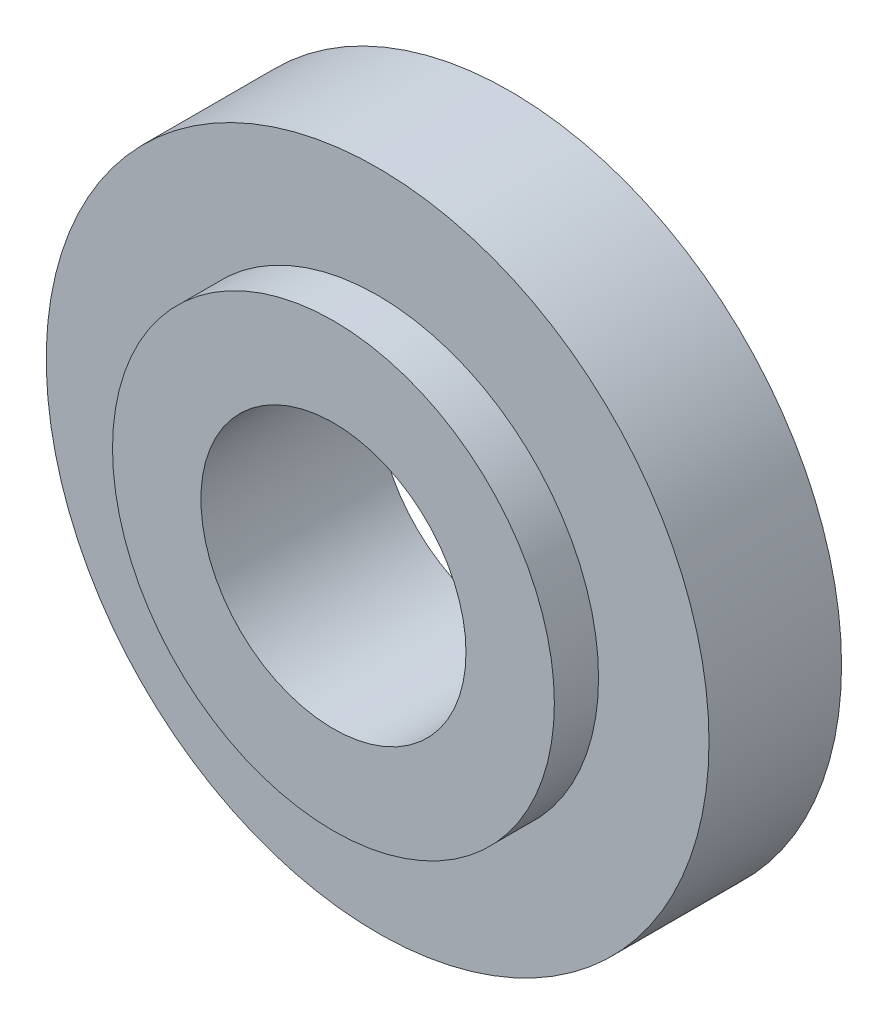
ISO-10303-21;
HEADER;
FILE_DESCRIPTION(('STEP AP214'),'2;1');
FILE_NAME('part.step','',(''),(''),'','','');
FILE_SCHEMA(('AUTOMOTIVE_DESIGN { 1 0 10303 214 1 1 1 1 }'));
ENDSEC;
DATA;
#1=APPLICATION_CONTEXT('core data for automotive mechanical design processes');
#2=APPLICATION_PROTOCOL_DEFINITION('international standard','automotive_design',2000,#1);
#3=PRODUCT_CONTEXT('',#1,'mechanical');
#4=PRODUCT('Part','Part','',(#3));
#5=PRODUCT_RELATED_PRODUCT_CATEGORY('part','',(#4));
#6=PRODUCT_DEFINITION_FORMATION('','',#4);
#7=PRODUCT_DEFINITION_CONTEXT('part definition',#1,'design');
#8=PRODUCT_DEFINITION('design','',#6,#7);
#9=PRODUCT_DEFINITION_SHAPE('','',#8);
#10=(LENGTH_UNIT() NAMED_UNIT(*) SI_UNIT(.MILLI.,.METRE.));
#11=(NAMED_UNIT(*) PLANE_ANGLE_UNIT() SI_UNIT($,.RADIAN.));
#12=(NAMED_UNIT(*) SI_UNIT($,.STERADIAN.) SOLID_ANGLE_UNIT());
#13=UNCERTAINTY_MEASURE_WITH_UNIT(LENGTH_MEASURE(1.E-05),#10,'distance_accuracy_value','');
#14=(GEOMETRIC_REPRESENTATION_CONTEXT(3) GLOBAL_UNCERTAINTY_ASSIGNED_CONTEXT((#13)) GLOBAL_UNIT_ASSIGNED_CONTEXT((#10,
#11,#12)) REPRESENTATION_CONTEXT('',''));
#15=CARTESIAN_POINT('',(0.,0.,0.));
#16=DIRECTION('',(0.,0.,1.));
#17=DIRECTION('',(1.,0.,0.));
#18=AXIS2_PLACEMENT_3D('',#15,#16,#17);
#19=CARTESIAN_POINT('',(0.,0.,1.5));
#20=DIRECTION('',(0.,0.,1.));
#21=DIRECTION('',(1.,0.,0.));
#22=AXIS2_PLACEMENT_3D('',#19,#20,#21);
#23=PLANE('',#22);
#24=CARTESIAN_POINT('',(0.,0.,1.5));
#25=DIRECTION('',(0.,0.,1.));
#26=DIRECTION('',(1.,0.,0.));
#27=AXIS2_PLACEMENT_3D('',#24,#25,#26);
#28=CIRCLE('',#27,3.75);
#29=CARTESIAN_POINT('',(3.75,0.,1.5));
#30=VERTEX_POINT('',#29);
#31=EDGE_CURVE('E10',#30,#30,#28,.T.);
#32=ORIENTED_EDGE('',*,*,#31,.T.);
#33=EDGE_LOOP('',(#32));
#34=FACE_BOUND('',#33,.T.);
#35=CARTESIAN_POINT('',(0.,0.,1.5));
#36=DIRECTION('',(0.,0.,1.));
#37=DIRECTION('',(1.,0.,0.));
#38=AXIS2_PLACEMENT_3D('',#35,#36,#37);
#39=CIRCLE('',#38,2.5);
#40=CARTESIAN_POINT('',(2.5,0.,1.5));
#41=VERTEX_POINT('',#40);
#42=EDGE_CURVE('E46',#41,#41,#39,.T.);
#43=ORIENTED_EDGE('',*,*,#42,.F.);
#44=EDGE_LOOP('',(#43));
#45=FACE_BOUND('',#44,.T.);
#46=ADVANCED_FACE('F32',(#34,#45),#23,.T.);
#47=CARTESIAN_POINT('',(0.,0.,1.5));
#48=DIRECTION('',(0.,0.,-1.));
#49=DIRECTION('',(-1.,0.,0.));
#50=AXIS2_PLACEMENT_3D('',#47,#48,#49);
#51=CYLINDRICAL_SURFACE('',#50,3.75);
#52=ORIENTED_EDGE('',*,*,#31,.F.);
#53=EDGE_LOOP('',(#52));
#54=FACE_BOUND('',#53,.T.);
#55=CARTESIAN_POINT('',(0.,0.,0.));
#56=DIRECTION('',(0.,0.,1.));
#57=DIRECTION('',(1.,0.,0.));
#58=AXIS2_PLACEMENT_3D('',#55,#56,#57);
#59=CIRCLE('',#58,3.75);
#60=CARTESIAN_POINT('',(3.75,0.,0.));
#61=VERTEX_POINT('',#60);
#62=EDGE_CURVE('E44',#61,#61,#59,.T.);
#63=ORIENTED_EDGE('',*,*,#62,.T.);
#64=EDGE_LOOP('',(#63));
#65=FACE_BOUND('',#64,.T.);
#66=ADVANCED_FACE('F34',(#54,#65),#51,.T.);
#67=CARTESIAN_POINT('',(0.,0.,1.5));
#68=DIRECTION('',(0.,0.,-1.));
#69=DIRECTION('',(-1.,0.,0.));
#70=AXIS2_PLACEMENT_3D('',#67,#68,#69);
#71=CYLINDRICAL_SURFACE('',#70,1.5);
#72=CARTESIAN_POINT('',(0.,0.,0.));
#73=DIRECTION('',(0.,0.,1.));
#74=DIRECTION('',(1.,0.,0.));
#75=AXIS2_PLACEMENT_3D('',#72,#73,#74);
#76=CIRCLE('',#75,1.5);
#77=CARTESIAN_POINT('',(1.5,0.,0.));
#78=VERTEX_POINT('',#77);
#79=EDGE_CURVE('E36',#78,#78,#76,.T.);
#80=ORIENTED_EDGE('',*,*,#79,.F.);
#81=EDGE_LOOP('',(#80));
#82=FACE_BOUND('',#81,.T.);
#83=CARTESIAN_POINT('',(0.,0.,2.));
#84=DIRECTION('',(0.,0.,1.));
#85=DIRECTION('',(1.,0.,0.));
#86=AXIS2_PLACEMENT_3D('',#83,#84,#85);
#87=CIRCLE('',#86,1.5);
#88=CARTESIAN_POINT('',(1.5,0.,2.));
#89=VERTEX_POINT('',#88);
#90=EDGE_CURVE('E56',#89,#89,#87,.T.);
#91=ORIENTED_EDGE('',*,*,#90,.T.);
#92=EDGE_LOOP('',(#91));
#93=FACE_BOUND('',#92,.T.);
#94=ADVANCED_FACE('F61',(#82,#93),#71,.F.);
#95=CARTESIAN_POINT('',(0.,0.,0.));
#96=DIRECTION('',(0.,0.,1.));
#97=DIRECTION('',(1.,0.,0.));
#98=AXIS2_PLACEMENT_3D('',#95,#96,#97);
#99=PLANE('',#98);
#100=ORIENTED_EDGE('',*,*,#62,.F.);
#101=EDGE_LOOP('',(#100));
#102=FACE_BOUND('',#101,.T.);
#103=ORIENTED_EDGE('',*,*,#79,.T.);
#104=EDGE_LOOP('',(#103));
#105=FACE_BOUND('',#104,.T.);
#106=ADVANCED_FACE('F66',(#102,#105),#99,.F.);
#107=CARTESIAN_POINT('',(0.,0.,2.));
#108=DIRECTION('',(0.,0.,1.));
#109=DIRECTION('',(1.,0.,0.));
#110=AXIS2_PLACEMENT_3D('',#107,#108,#109);
#111=PLANE('',#110);
#112=CARTESIAN_POINT('',(0.,0.,2.));
#113=DIRECTION('',(0.,0.,1.));
#114=DIRECTION('',(1.,0.,0.));
#115=AXIS2_PLACEMENT_3D('',#112,#113,#114);
#116=CIRCLE('',#115,2.5);
#117=CARTESIAN_POINT('',(2.5,0.,2.));
#118=VERTEX_POINT('',#117);
#119=EDGE_CURVE('E49',#118,#118,#116,.T.);
#120=ORIENTED_EDGE('',*,*,#119,.T.);
#121=EDGE_LOOP('',(#120));
#122=FACE_BOUND('',#121,.T.);
#123=ORIENTED_EDGE('',*,*,#90,.F.);
#124=EDGE_LOOP('',(#123));
#125=FACE_BOUND('',#124,.T.);
#126=ADVANCED_FACE('F63',(#122,#125),#111,.T.);
#127=CARTESIAN_POINT('',(0.,0.,2.));
#128=DIRECTION('',(0.,0.,-1.));
#129=DIRECTION('',(-1.,0.,0.));
#130=AXIS2_PLACEMENT_3D('',#127,#128,#129);
#131=CYLINDRICAL_SURFACE('',#130,2.5);
#132=ORIENTED_EDGE('',*,*,#119,.F.);
#133=EDGE_LOOP('',(#132));
#134=FACE_BOUND('',#133,.T.);
#135=ORIENTED_EDGE('',*,*,#42,.T.);
#136=EDGE_LOOP('',(#135));
#137=FACE_BOUND('',#136,.T.);
#138=ADVANCED_FACE('F65',(#134,#137),#131,.T.);
#139=CLOSED_SHELL('',(#46,#66,#94,#106,#126,#138));
#140=MANIFOLD_SOLID_BREP('B2',#139);
#141=ADVANCED_BREP_SHAPE_REPRESENTATION('',(#18,#140),#14);
#142=SHAPE_DEFINITION_REPRESENTATION(#9,#141);
ENDSEC;
END-ISO-10303-21;
